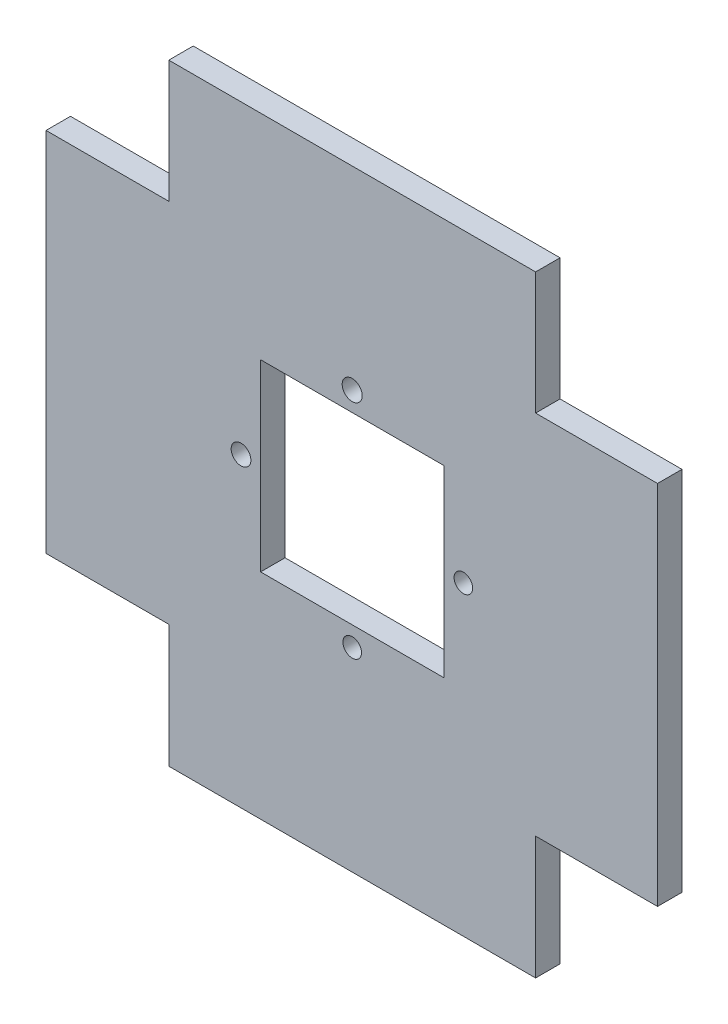
ISO-10303-21;
HEADER;
FILE_DESCRIPTION(('STEP AP214'),'2;1');
FILE_NAME('part.step','',(''),(''),'','','');
FILE_SCHEMA(('AUTOMOTIVE_DESIGN { 1 0 10303 214 1 1 1 1 }'));
ENDSEC;
DATA;
#1=APPLICATION_CONTEXT('core data for automotive mechanical design processes');
#2=APPLICATION_PROTOCOL_DEFINITION('international standard','automotive_design',2000,#1);
#3=PRODUCT_CONTEXT('',#1,'mechanical');
#4=PRODUCT('Part','Part','',(#3));
#5=PRODUCT_RELATED_PRODUCT_CATEGORY('part','',(#4));
#6=PRODUCT_DEFINITION_FORMATION('','',#4);
#7=PRODUCT_DEFINITION_CONTEXT('part definition',#1,'design');
#8=PRODUCT_DEFINITION('design','',#6,#7);
#9=PRODUCT_DEFINITION_SHAPE('','',#8);
#10=(LENGTH_UNIT() NAMED_UNIT(*) SI_UNIT(.MILLI.,.METRE.));
#11=(NAMED_UNIT(*) PLANE_ANGLE_UNIT() SI_UNIT($,.RADIAN.));
#12=(NAMED_UNIT(*) SI_UNIT($,.STERADIAN.) SOLID_ANGLE_UNIT());
#13=UNCERTAINTY_MEASURE_WITH_UNIT(LENGTH_MEASURE(1.E-05),#10,'distance_accuracy_value','');
#14=(GEOMETRIC_REPRESENTATION_CONTEXT(3) GLOBAL_UNCERTAINTY_ASSIGNED_CONTEXT((#13)) GLOBAL_UNIT_ASSIGNED_CONTEXT((#10,
#11,#12)) REPRESENTATION_CONTEXT('',''));
#15=CARTESIAN_POINT('',(0.,0.,0.));
#16=DIRECTION('',(0.,0.,1.));
#17=DIRECTION('',(1.,0.,0.));
#18=AXIS2_PLACEMENT_3D('',#15,#16,#17);
#19=CARTESIAN_POINT('',(0.,0.,5.08));
#20=DIRECTION('',(0.,0.,-1.));
#21=DIRECTION('',(-1.,0.,0.));
#22=AXIS2_PLACEMENT_3D('',#19,#20,#21);
#23=PLANE('',#22);
#24=DIRECTION('',(0.,1.,0.));
#25=VECTOR('',#24,1.);
#26=CARTESIAN_POINT('',(49.3720443960014,30.5126851184203,5.08));
#27=LINE('',#26,#25);
#28=CARTESIAN_POINT('',(49.3720443960015,5.12221589112444,5.08));
#29=VERTEX_POINT('',#28);
#30=CARTESIAN_POINT('',(49.3720443960014,30.5126851184203,5.08));
#31=VERTEX_POINT('',#30);
#32=EDGE_CURVE('E185',#29,#31,#27,.T.);
#33=ORIENTED_EDGE('',*,*,#32,.T.);
#34=DIRECTION('',(-1.,0.,0.));
#35=VECTOR('',#34,1.);
#36=CARTESIAN_POINT('',(49.3720443960014,30.5126851184203,5.08));
#37=LINE('',#36,#35);
#38=CARTESIAN_POINT('',(-26.8112910536944,30.5126851184203,5.08));
#39=VERTEX_POINT('',#38);
#40=EDGE_CURVE('E188',#31,#39,#37,.T.);
#41=ORIENTED_EDGE('',*,*,#40,.T.);
#42=DIRECTION('',(0.,-1.,0.));
#43=VECTOR('',#42,1.);
#44=CARTESIAN_POINT('',(-26.8112910536944,30.5126851184203,5.08));
#45=LINE('',#44,#43);
#46=CARTESIAN_POINT('',(-26.8112910536944,5.1222158911246,5.08));
#47=VERTEX_POINT('',#46);
#48=EDGE_CURVE('E191',#39,#47,#45,.T.);
#49=ORIENTED_EDGE('',*,*,#48,.T.);
#50=DIRECTION('',(-1.,0.,0.));
#51=VECTOR('',#50,1.);
#52=CARTESIAN_POINT('',(-52.3074602030063,5.1222158911246,5.08));
#53=LINE('',#52,#51);
#54=CARTESIAN_POINT('',(-52.3074602030063,5.1222158911246,5.08));
#55=VERTEX_POINT('',#54);
#56=EDGE_CURVE('E193',#47,#55,#53,.T.);
#57=ORIENTED_EDGE('',*,*,#56,.T.);
#58=DIRECTION('',(0.,-1.,0.));
#59=VECTOR('',#58,1.);
#60=CARTESIAN_POINT('',(-52.3074602030063,5.1222158911246,5.08));
#61=LINE('',#60,#59);
#62=CARTESIAN_POINT('',(-52.3074602030063,-70.962795052029,5.08));
#63=VERTEX_POINT('',#62);
#64=EDGE_CURVE('E195',#55,#63,#61,.T.);
#65=ORIENTED_EDGE('',*,*,#64,.T.);
#66=DIRECTION('',(1.,0.,0.));
#67=VECTOR('',#66,1.);
#68=CARTESIAN_POINT('',(-52.3074602030063,-70.962795052029,5.08));
#69=LINE('',#68,#67);
#70=CARTESIAN_POINT('',(-26.8112910536944,-70.962795052029,5.08));
#71=VERTEX_POINT('',#70);
#72=EDGE_CURVE('E197',#63,#71,#69,.T.);
#73=ORIENTED_EDGE('',*,*,#72,.T.);
#74=DIRECTION('',(0.,-1.,0.));
#75=VECTOR('',#74,1.);
#76=CARTESIAN_POINT('',(-26.8112910536944,-96.4873148815797,5.08));
#77=LINE('',#76,#75);
#78=CARTESIAN_POINT('',(-26.8112910536944,-96.4873148815797,5.08));
#79=VERTEX_POINT('',#78);
#80=EDGE_CURVE('E199',#71,#79,#77,.T.);
#81=ORIENTED_EDGE('',*,*,#80,.T.);
#82=DIRECTION('',(1.,0.,0.));
#83=VECTOR('',#82,1.);
#84=CARTESIAN_POINT('',(49.3720443960015,-96.4873148815797,5.08));
#85=LINE('',#84,#83);
#86=CARTESIAN_POINT('',(49.3720443960015,-96.4873148815797,5.08));
#87=VERTEX_POINT('',#86);
#88=EDGE_CURVE('E201',#79,#87,#85,.T.);
#89=ORIENTED_EDGE('',*,*,#88,.T.);
#90=DIRECTION('',(0.,1.,0.));
#91=VECTOR('',#90,1.);
#92=CARTESIAN_POINT('',(49.3720443960015,-96.4873148815797,5.08));
#93=LINE('',#92,#91);
#94=CARTESIAN_POINT('',(49.3720443960015,-70.962795052029,5.08));
#95=VERTEX_POINT('',#94);
#96=EDGE_CURVE('E203',#87,#95,#93,.T.);
#97=ORIENTED_EDGE('',*,*,#96,.T.);
#98=DIRECTION('',(1.,0.,0.));
#99=VECTOR('',#98,1.);
#100=CARTESIAN_POINT('',(74.6925397969937,-70.962795052029,5.08));
#101=LINE('',#100,#99);
#102=CARTESIAN_POINT('',(74.6925397969937,-70.962795052029,5.08));
#103=VERTEX_POINT('',#102);
#104=EDGE_CURVE('E205',#95,#103,#101,.T.);
#105=ORIENTED_EDGE('',*,*,#104,.T.);
#106=DIRECTION('',(0.,1.,0.));
#107=VECTOR('',#106,1.);
#108=CARTESIAN_POINT('',(74.6925397969937,5.1222158911246,5.08));
#109=LINE('',#108,#107);
#110=CARTESIAN_POINT('',(74.6925397969937,5.1222158911246,5.08));
#111=VERTEX_POINT('',#110);
#112=EDGE_CURVE('E207',#103,#111,#109,.T.);
#113=ORIENTED_EDGE('',*,*,#112,.T.);
#114=DIRECTION('',(-1.,0.,0.));
#115=VECTOR('',#114,1.);
#116=CARTESIAN_POINT('',(74.6925397969937,5.1222158911246,5.08));
#117=LINE('',#116,#115);
#118=EDGE_CURVE('E209',#111,#29,#117,.T.);
#119=ORIENTED_EDGE('',*,*,#118,.T.);
#120=EDGE_LOOP('',(#33,#41,#49,#57,#65,#73,#81,#89,#97,#105,#113,#119));
#121=FACE_BOUND('',#120,.T.);
#122=DIRECTION('',(0.,1.,0.));
#123=VECTOR('',#122,1.);
#124=CARTESIAN_POINT('',(30.3055315080126,-13.8368028294726,5.08));
#125=LINE('',#124,#123);
#126=CARTESIAN_POINT('',(30.3055315080126,-52.0037763314318,5.08));
#127=VERTEX_POINT('',#126);
#128=CARTESIAN_POINT('',(30.3055315080126,-13.8368028294726,5.08));
#129=VERTEX_POINT('',#128);
#130=EDGE_CURVE('E146',#127,#129,#125,.T.);
#131=ORIENTED_EDGE('',*,*,#130,.F.);
#132=DIRECTION('',(1.,0.,0.));
#133=VECTOR('',#132,1.);
#134=CARTESIAN_POINT('',(-7.74477816570549,-52.0037763314318,5.08));
#135=LINE('',#134,#133);
#136=CARTESIAN_POINT('',(-7.74477816570549,-52.0037763314318,5.08));
#137=VERTEX_POINT('',#136);
#138=EDGE_CURVE('E169',#137,#127,#135,.T.);
#139=ORIENTED_EDGE('',*,*,#138,.F.);
#140=DIRECTION('',(0.,-1.,0.));
#141=VECTOR('',#140,1.);
#142=CARTESIAN_POINT('',(-7.74477816570549,-13.8368028294726,5.08));
#143=LINE('',#142,#141);
#144=CARTESIAN_POINT('',(-7.74477816570549,-13.8368028294726,5.08));
#145=VERTEX_POINT('',#144);
#146=EDGE_CURVE('E167',#145,#137,#143,.T.);
#147=ORIENTED_EDGE('',*,*,#146,.F.);
#148=DIRECTION('',(-1.,0.,0.));
#149=VECTOR('',#148,1.);
#150=CARTESIAN_POINT('',(-7.74477816570549,-13.8368028294726,5.08));
#151=LINE('',#150,#149);
#152=EDGE_CURVE('E154',#129,#145,#151,.T.);
#153=ORIENTED_EDGE('',*,*,#152,.F.);
#154=EDGE_LOOP('',(#131,#139,#147,#153));
#155=FACE_BOUND('',#154,.T.);
#156=CARTESIAN_POINT('',(11.2803766711535,-9.77280282947262,5.08));
#157=DIRECTION('',(0.,0.,1.));
#158=DIRECTION('',(1.,0.,0.));
#159=AXIS2_PLACEMENT_3D('',#156,#157,#158);
#160=CIRCLE('',#159,2.08028948005198);
#161=CARTESIAN_POINT('',(13.3606661512055,-9.77280282947262,5.08));
#162=VERTEX_POINT('',#161);
#163=EDGE_CURVE('E175',#162,#162,#160,.T.);
#164=ORIENTED_EDGE('',*,*,#163,.F.);
#165=EDGE_LOOP('',(#164));
#166=FACE_BOUND('',#165,.T.);
#167=CARTESIAN_POINT('',(34.3695315080126,-32.9202895804522,5.08));
#168=DIRECTION('',(0.,0.,1.));
#169=DIRECTION('',(1.,0.,0.));
#170=AXIS2_PLACEMENT_3D('',#167,#168,#169);
#171=CIRCLE('',#170,1.93060522333524);
#172=CARTESIAN_POINT('',(36.3001367313478,-32.9202895804522,5.08));
#173=VERTEX_POINT('',#172);
#174=EDGE_CURVE('E529',#173,#173,#171,.T.);
#175=ORIENTED_EDGE('',*,*,#174,.F.);
#176=EDGE_LOOP('',(#175));
#177=FACE_BOUND('',#176,.T.);
#178=CARTESIAN_POINT('',(11.2803766711535,-56.0677763314318,5.08));
#179=DIRECTION('',(0.,0.,1.));
#180=DIRECTION('',(1.,0.,0.));
#181=AXIS2_PLACEMENT_3D('',#178,#179,#180);
#182=CIRCLE('',#181,1.93164346510318);
#183=CARTESIAN_POINT('',(13.2120201362567,-56.0677763314318,5.08));
#184=VERTEX_POINT('',#183);
#185=EDGE_CURVE('E523',#184,#184,#182,.T.);
#186=ORIENTED_EDGE('',*,*,#185,.F.);
#187=EDGE_LOOP('',(#186));
#188=FACE_BOUND('',#187,.T.);
#189=CARTESIAN_POINT('',(-11.8087781657055,-32.9202895804522,5.08));
#190=DIRECTION('',(0.,0.,1.));
#191=DIRECTION('',(1.,0.,0.));
#192=AXIS2_PLACEMENT_3D('',#189,#190,#191);
#193=CIRCLE('',#192,2.05196005215576);
#194=CARTESIAN_POINT('',(-9.75681811354972,-32.9202895804522,5.08));
#195=VERTEX_POINT('',#194);
#196=EDGE_CURVE('E514',#195,#195,#193,.T.);
#197=ORIENTED_EDGE('',*,*,#196,.F.);
#198=EDGE_LOOP('',(#197));
#199=FACE_BOUND('',#198,.T.);
#200=ADVANCED_FACE('F33',(#121,#155,#166,#177,#188,#199),#23,.F.);
#201=CARTESIAN_POINT('',(0.,0.,0.));
#202=DIRECTION('',(0.,0.,-1.));
#203=DIRECTION('',(-1.,0.,0.));
#204=AXIS2_PLACEMENT_3D('',#201,#202,#203);
#205=PLANE('',#204);
#206=CARTESIAN_POINT('',(11.2803766711535,-56.0677763314318,0.));
#207=DIRECTION('',(0.,0.,1.));
#208=DIRECTION('',(1.,0.,0.));
#209=AXIS2_PLACEMENT_3D('',#206,#207,#208);
#210=CIRCLE('',#209,1.93164346510318);
#211=CARTESIAN_POINT('',(13.2120201362567,-56.0677763314318,0.));
#212=VERTEX_POINT('',#211);
#213=EDGE_CURVE('E520',#212,#212,#210,.T.);
#214=ORIENTED_EDGE('',*,*,#213,.T.);
#215=EDGE_LOOP('',(#214));
#216=FACE_BOUND('',#215,.T.);
#217=CARTESIAN_POINT('',(11.2803766711535,-9.77280282947262,0.));
#218=DIRECTION('',(0.,0.,1.));
#219=DIRECTION('',(1.,0.,0.));
#220=AXIS2_PLACEMENT_3D('',#217,#218,#219);
#221=CIRCLE('',#220,2.08028948005198);
#222=CARTESIAN_POINT('',(13.3606661512055,-9.77280282947262,0.));
#223=VERTEX_POINT('',#222);
#224=EDGE_CURVE('E532',#223,#223,#221,.T.);
#225=ORIENTED_EDGE('',*,*,#224,.T.);
#226=EDGE_LOOP('',(#225));
#227=FACE_BOUND('',#226,.T.);
#228=DIRECTION('',(0.,1.,0.));
#229=VECTOR('',#228,1.);
#230=CARTESIAN_POINT('',(49.3720443960014,30.5126851184203,0.));
#231=LINE('',#230,#229);
#232=CARTESIAN_POINT('',(49.3720443960015,5.12221589112444,0.));
#233=VERTEX_POINT('',#232);
#234=CARTESIAN_POINT('',(49.3720443960014,30.5126851184203,0.));
#235=VERTEX_POINT('',#234);
#236=EDGE_CURVE('E162',#233,#235,#231,.T.);
#237=ORIENTED_EDGE('',*,*,#236,.F.);
#238=DIRECTION('',(-1.,0.,0.));
#239=VECTOR('',#238,1.);
#240=CARTESIAN_POINT('',(74.6925397969937,5.1222158911246,0.));
#241=LINE('',#240,#239);
#242=CARTESIAN_POINT('',(74.6925397969937,5.1222158911246,0.));
#243=VERTEX_POINT('',#242);
#244=EDGE_CURVE('E189',#243,#233,#241,.T.);
#245=ORIENTED_EDGE('',*,*,#244,.F.);
#246=DIRECTION('',(0.,1.,0.));
#247=VECTOR('',#246,1.);
#248=CARTESIAN_POINT('',(74.6925397969937,5.1222158911246,0.));
#249=LINE('',#248,#247);
#250=CARTESIAN_POINT('',(74.6925397969937,-70.962795052029,0.));
#251=VERTEX_POINT('',#250);
#252=EDGE_CURVE('E232',#251,#243,#249,.T.);
#253=ORIENTED_EDGE('',*,*,#252,.F.);
#254=DIRECTION('',(1.,0.,0.));
#255=VECTOR('',#254,1.);
#256=CARTESIAN_POINT('',(74.6925397969937,-70.962795052029,0.));
#257=LINE('',#256,#255);
#258=CARTESIAN_POINT('',(49.3720443960015,-70.962795052029,0.));
#259=VERTEX_POINT('',#258);
#260=EDGE_CURVE('E230',#259,#251,#257,.T.);
#261=ORIENTED_EDGE('',*,*,#260,.F.);
#262=DIRECTION('',(0.,1.,0.));
#263=VECTOR('',#262,1.);
#264=CARTESIAN_POINT('',(49.3720443960015,-96.4873148815797,0.));
#265=LINE('',#264,#263);
#266=CARTESIAN_POINT('',(49.3720443960015,-96.4873148815797,0.));
#267=VERTEX_POINT('',#266);
#268=EDGE_CURVE('E228',#267,#259,#265,.T.);
#269=ORIENTED_EDGE('',*,*,#268,.F.);
#270=DIRECTION('',(1.,0.,0.));
#271=VECTOR('',#270,1.);
#272=CARTESIAN_POINT('',(49.3720443960015,-96.4873148815797,0.));
#273=LINE('',#272,#271);
#274=CARTESIAN_POINT('',(-26.8112910536944,-96.4873148815797,0.));
#275=VERTEX_POINT('',#274);
#276=EDGE_CURVE('E226',#275,#267,#273,.T.);
#277=ORIENTED_EDGE('',*,*,#276,.F.);
#278=DIRECTION('',(0.,-1.,0.));
#279=VECTOR('',#278,1.);
#280=CARTESIAN_POINT('',(-26.8112910536944,-96.4873148815797,0.));
#281=LINE('',#280,#279);
#282=CARTESIAN_POINT('',(-26.8112910536944,-70.962795052029,0.));
#283=VERTEX_POINT('',#282);
#284=EDGE_CURVE('E224',#283,#275,#281,.T.);
#285=ORIENTED_EDGE('',*,*,#284,.F.);
#286=DIRECTION('',(1.,0.,0.));
#287=VECTOR('',#286,1.);
#288=CARTESIAN_POINT('',(-52.3074602030063,-70.962795052029,0.));
#289=LINE('',#288,#287);
#290=CARTESIAN_POINT('',(-52.3074602030063,-70.962795052029,0.));
#291=VERTEX_POINT('',#290);
#292=EDGE_CURVE('E222',#291,#283,#289,.T.);
#293=ORIENTED_EDGE('',*,*,#292,.F.);
#294=DIRECTION('',(0.,-1.,0.));
#295=VECTOR('',#294,1.);
#296=CARTESIAN_POINT('',(-52.3074602030063,5.1222158911246,0.));
#297=LINE('',#296,#295);
#298=CARTESIAN_POINT('',(-52.3074602030063,5.1222158911246,0.));
#299=VERTEX_POINT('',#298);
#300=EDGE_CURVE('E220',#299,#291,#297,.T.);
#301=ORIENTED_EDGE('',*,*,#300,.F.);
#302=DIRECTION('',(-1.,0.,0.));
#303=VECTOR('',#302,1.);
#304=CARTESIAN_POINT('',(-52.3074602030063,5.1222158911246,0.));
#305=LINE('',#304,#303);
#306=CARTESIAN_POINT('',(-26.8112910536944,5.1222158911246,0.));
#307=VERTEX_POINT('',#306);
#308=EDGE_CURVE('E218',#307,#299,#305,.T.);
#309=ORIENTED_EDGE('',*,*,#308,.F.);
#310=DIRECTION('',(0.,-1.,0.));
#311=VECTOR('',#310,1.);
#312=CARTESIAN_POINT('',(-26.8112910536944,30.5126851184203,0.));
#313=LINE('',#312,#311);
#314=CARTESIAN_POINT('',(-26.8112910536944,30.5126851184203,0.));
#315=VERTEX_POINT('',#314);
#316=EDGE_CURVE('E216',#315,#307,#313,.T.);
#317=ORIENTED_EDGE('',*,*,#316,.F.);
#318=DIRECTION('',(-1.,0.,0.));
#319=VECTOR('',#318,1.);
#320=CARTESIAN_POINT('',(49.3720443960014,30.5126851184203,0.));
#321=LINE('',#320,#319);
#322=EDGE_CURVE('E214',#235,#315,#321,.T.);
#323=ORIENTED_EDGE('',*,*,#322,.F.);
#324=EDGE_LOOP('',(#237,#245,#253,#261,#269,#277,#285,#293,#301,#309,#317,#323));
#325=FACE_BOUND('',#324,.T.);
#326=DIRECTION('',(1.,0.,0.));
#327=VECTOR('',#326,1.);
#328=CARTESIAN_POINT('',(-7.74477816570549,-52.0037763314318,0.));
#329=LINE('',#328,#327);
#330=CARTESIAN_POINT('',(-7.74477816570549,-52.0037763314318,0.));
#331=VERTEX_POINT('',#330);
#332=CARTESIAN_POINT('',(30.3055315080126,-52.0037763314318,0.));
#333=VERTEX_POINT('',#332);
#334=EDGE_CURVE('E155',#331,#333,#329,.T.);
#335=ORIENTED_EDGE('',*,*,#334,.T.);
#336=DIRECTION('',(0.,1.,0.));
#337=VECTOR('',#336,1.);
#338=CARTESIAN_POINT('',(30.3055315080126,-13.8368028294726,0.));
#339=LINE('',#338,#337);
#340=CARTESIAN_POINT('',(30.3055315080126,-13.8368028294726,0.));
#341=VERTEX_POINT('',#340);
#342=EDGE_CURVE('E56',#333,#341,#339,.T.);
#343=ORIENTED_EDGE('',*,*,#342,.T.);
#344=DIRECTION('',(-1.,0.,0.));
#345=VECTOR('',#344,1.);
#346=CARTESIAN_POINT('',(-7.74477816570549,-13.8368028294726,0.));
#347=LINE('',#346,#345);
#348=CARTESIAN_POINT('',(-7.74477816570549,-13.8368028294726,0.));
#349=VERTEX_POINT('',#348);
#350=EDGE_CURVE('E161',#341,#349,#347,.T.);
#351=ORIENTED_EDGE('',*,*,#350,.T.);
#352=DIRECTION('',(0.,-1.,0.));
#353=VECTOR('',#352,1.);
#354=CARTESIAN_POINT('',(-7.74477816570549,-13.8368028294726,0.));
#355=LINE('',#354,#353);
#356=EDGE_CURVE('E177',#349,#331,#355,.T.);
#357=ORIENTED_EDGE('',*,*,#356,.T.);
#358=EDGE_LOOP('',(#335,#343,#351,#357));
#359=FACE_BOUND('',#358,.T.);
#360=CARTESIAN_POINT('',(34.3695315080126,-32.9202895804522,0.));
#361=DIRECTION('',(0.,0.,1.));
#362=DIRECTION('',(1.,0.,0.));
#363=AXIS2_PLACEMENT_3D('',#360,#361,#362);
#364=CIRCLE('',#363,1.93060522333524);
#365=CARTESIAN_POINT('',(36.3001367313478,-32.9202895804522,0.));
#366=VERTEX_POINT('',#365);
#367=EDGE_CURVE('E526',#366,#366,#364,.T.);
#368=ORIENTED_EDGE('',*,*,#367,.T.);
#369=EDGE_LOOP('',(#368));
#370=FACE_BOUND('',#369,.T.);
#371=CARTESIAN_POINT('',(-11.8087781657055,-32.9202895804522,0.));
#372=DIRECTION('',(0.,0.,1.));
#373=DIRECTION('',(1.,0.,0.));
#374=AXIS2_PLACEMENT_3D('',#371,#372,#373);
#375=CIRCLE('',#374,2.05196005215576);
#376=CARTESIAN_POINT('',(-9.75681811354972,-32.9202895804522,0.));
#377=VERTEX_POINT('',#376);
#378=EDGE_CURVE('E517',#377,#377,#375,.T.);
#379=ORIENTED_EDGE('',*,*,#378,.T.);
#380=EDGE_LOOP('',(#379));
#381=FACE_BOUND('',#380,.T.);
#382=ADVANCED_FACE('F274',(#216,#227,#325,#359,#370,#381),#205,.T.);
#383=CARTESIAN_POINT('',(49.3720443960014,30.5126851184203,5.08));
#384=DIRECTION('',(-1.,0.,0.));
#385=DIRECTION('',(0.,-1.,0.));
#386=AXIS2_PLACEMENT_3D('',#383,#384,#385);
#387=PLANE('',#386);
#388=ORIENTED_EDGE('',*,*,#236,.T.);
#389=DIRECTION('',(0.,0.,-1.));
#390=VECTOR('',#389,1.);
#391=CARTESIAN_POINT('',(49.3720443960014,30.5126851184203,5.08));
#392=LINE('',#391,#390);
#393=EDGE_CURVE('E11',#31,#235,#392,.T.);
#394=ORIENTED_EDGE('',*,*,#393,.F.);
#395=ORIENTED_EDGE('',*,*,#32,.F.);
#396=DIRECTION('',(0.,0.,-1.));
#397=VECTOR('',#396,1.);
#398=CARTESIAN_POINT('',(49.3720443960015,5.12221589112444,5.08));
#399=LINE('',#398,#397);
#400=EDGE_CURVE('E211',#29,#233,#399,.T.);
#401=ORIENTED_EDGE('',*,*,#400,.T.);
#402=EDGE_LOOP('',(#388,#394,#395,#401));
#403=FACE_BOUND('',#402,.T.);
#404=ADVANCED_FACE('F35',(#403),#387,.F.);
#405=CARTESIAN_POINT('',(49.3720443960014,30.5126851184203,5.08));
#406=DIRECTION('',(0.,-1.,0.));
#407=DIRECTION('',(1.,0.,0.));
#408=AXIS2_PLACEMENT_3D('',#405,#406,#407);
#409=PLANE('',#408);
#410=ORIENTED_EDGE('',*,*,#322,.T.);
#411=DIRECTION('',(0.,0.,-1.));
#412=VECTOR('',#411,1.);
#413=CARTESIAN_POINT('',(-26.8112910536944,30.5126851184203,5.08));
#414=LINE('',#413,#412);
#415=EDGE_CURVE('E41',#39,#315,#414,.T.);
#416=ORIENTED_EDGE('',*,*,#415,.F.);
#417=ORIENTED_EDGE('',*,*,#40,.F.);
#418=ORIENTED_EDGE('',*,*,#393,.T.);
#419=EDGE_LOOP('',(#410,#416,#417,#418));
#420=FACE_BOUND('',#419,.T.);
#421=ADVANCED_FACE('F291',(#420),#409,.F.);
#422=CARTESIAN_POINT('',(-26.8112910536944,30.5126851184203,5.08));
#423=DIRECTION('',(1.,0.,0.));
#424=DIRECTION('',(0.,1.,0.));
#425=AXIS2_PLACEMENT_3D('',#422,#423,#424);
#426=PLANE('',#425);
#427=ORIENTED_EDGE('',*,*,#316,.T.);
#428=DIRECTION('',(0.,0.,-1.));
#429=VECTOR('',#428,1.);
#430=CARTESIAN_POINT('',(-26.8112910536944,5.1222158911246,5.08));
#431=LINE('',#430,#429);
#432=EDGE_CURVE('E261',#47,#307,#431,.T.);
#433=ORIENTED_EDGE('',*,*,#432,.F.);
#434=ORIENTED_EDGE('',*,*,#48,.F.);
#435=ORIENTED_EDGE('',*,*,#415,.T.);
#436=EDGE_LOOP('',(#427,#433,#434,#435));
#437=FACE_BOUND('',#436,.T.);
#438=ADVANCED_FACE('F268',(#437),#426,.F.);
#439=CARTESIAN_POINT('',(-52.3074602030063,5.1222158911246,5.08));
#440=DIRECTION('',(0.,-1.,0.));
#441=DIRECTION('',(0.,0.,-1.));
#442=AXIS2_PLACEMENT_3D('',#439,#440,#441);
#443=PLANE('',#442);
#444=ORIENTED_EDGE('',*,*,#308,.T.);
#445=DIRECTION('',(0.,0.,-1.));
#446=VECTOR('',#445,1.);
#447=CARTESIAN_POINT('',(-52.3074602030063,5.1222158911246,5.08));
#448=LINE('',#447,#446);
#449=EDGE_CURVE('E258',#55,#299,#448,.T.);
#450=ORIENTED_EDGE('',*,*,#449,.F.);
#451=ORIENTED_EDGE('',*,*,#56,.F.);
#452=ORIENTED_EDGE('',*,*,#432,.T.);
#453=EDGE_LOOP('',(#444,#450,#451,#452));
#454=FACE_BOUND('',#453,.T.);
#455=ADVANCED_FACE('F280',(#454),#443,.F.);
#456=CARTESIAN_POINT('',(-52.3074602030063,5.1222158911246,5.08));
#457=DIRECTION('',(1.,0.,0.));
#458=DIRECTION('',(0.,1.,0.));
#459=AXIS2_PLACEMENT_3D('',#456,#457,#458);
#460=PLANE('',#459);
#461=ORIENTED_EDGE('',*,*,#300,.T.);
#462=DIRECTION('',(0.,0.,-1.));
#463=VECTOR('',#462,1.);
#464=CARTESIAN_POINT('',(-52.3074602030063,-70.962795052029,5.08));
#465=LINE('',#464,#463);
#466=EDGE_CURVE('E255',#63,#291,#465,.T.);
#467=ORIENTED_EDGE('',*,*,#466,.F.);
#468=ORIENTED_EDGE('',*,*,#64,.F.);
#469=ORIENTED_EDGE('',*,*,#449,.T.);
#470=EDGE_LOOP('',(#461,#467,#468,#469));
#471=FACE_BOUND('',#470,.T.);
#472=ADVANCED_FACE('F284',(#471),#460,.F.);
#473=CARTESIAN_POINT('',(-52.3074602030063,-70.962795052029,5.08));
#474=DIRECTION('',(0.,1.,0.));
#475=DIRECTION('',(0.,0.,1.));
#476=AXIS2_PLACEMENT_3D('',#473,#474,#475);
#477=PLANE('',#476);
#478=ORIENTED_EDGE('',*,*,#292,.T.);
#479=DIRECTION('',(0.,0.,-1.));
#480=VECTOR('',#479,1.);
#481=CARTESIAN_POINT('',(-26.8112910536944,-70.962795052029,5.08));
#482=LINE('',#481,#480);
#483=EDGE_CURVE('E252',#71,#283,#482,.T.);
#484=ORIENTED_EDGE('',*,*,#483,.F.);
#485=ORIENTED_EDGE('',*,*,#72,.F.);
#486=ORIENTED_EDGE('',*,*,#466,.T.);
#487=EDGE_LOOP('',(#478,#484,#485,#486));
#488=FACE_BOUND('',#487,.T.);
#489=ADVANCED_FACE('F324',(#488),#477,.F.);
#490=CARTESIAN_POINT('',(-26.8112910536944,-96.4873148815797,5.08));
#491=DIRECTION('',(1.,0.,0.));
#492=DIRECTION('',(0.,0.,-1.));
#493=AXIS2_PLACEMENT_3D('',#490,#491,#492);
#494=PLANE('',#493);
#495=ORIENTED_EDGE('',*,*,#284,.T.);
#496=DIRECTION('',(0.,0.,-1.));
#497=VECTOR('',#496,1.);
#498=CARTESIAN_POINT('',(-26.8112910536944,-96.4873148815797,5.08));
#499=LINE('',#498,#497);
#500=EDGE_CURVE('E249',#79,#275,#499,.T.);
#501=ORIENTED_EDGE('',*,*,#500,.F.);
#502=ORIENTED_EDGE('',*,*,#80,.F.);
#503=ORIENTED_EDGE('',*,*,#483,.T.);
#504=EDGE_LOOP('',(#495,#501,#502,#503));
#505=FACE_BOUND('',#504,.T.);
#506=ADVANCED_FACE('F322',(#505),#494,.F.);
#507=CARTESIAN_POINT('',(49.3720443960015,-96.4873148815797,5.08));
#508=DIRECTION('',(0.,1.,0.));
#509=DIRECTION('',(-1.,0.,0.));
#510=AXIS2_PLACEMENT_3D('',#507,#508,#509);
#511=PLANE('',#510);
#512=ORIENTED_EDGE('',*,*,#276,.T.);
#513=DIRECTION('',(0.,0.,-1.));
#514=VECTOR('',#513,1.);
#515=CARTESIAN_POINT('',(49.3720443960015,-96.4873148815797,5.08));
#516=LINE('',#515,#514);
#517=EDGE_CURVE('E246',#87,#267,#516,.T.);
#518=ORIENTED_EDGE('',*,*,#517,.F.);
#519=ORIENTED_EDGE('',*,*,#88,.F.);
#520=ORIENTED_EDGE('',*,*,#500,.T.);
#521=EDGE_LOOP('',(#512,#518,#519,#520));
#522=FACE_BOUND('',#521,.T.);
#523=ADVANCED_FACE('F318',(#522),#511,.F.);
#524=CARTESIAN_POINT('',(49.3720443960015,-96.4873148815797,5.08));
#525=DIRECTION('',(-1.,0.,0.));
#526=DIRECTION('',(0.,0.,1.));
#527=AXIS2_PLACEMENT_3D('',#524,#525,#526);
#528=PLANE('',#527);
#529=ORIENTED_EDGE('',*,*,#268,.T.);
#530=DIRECTION('',(0.,0.,-1.));
#531=VECTOR('',#530,1.);
#532=CARTESIAN_POINT('',(49.3720443960015,-70.962795052029,5.08));
#533=LINE('',#532,#531);
#534=EDGE_CURVE('E243',#95,#259,#533,.T.);
#535=ORIENTED_EDGE('',*,*,#534,.F.);
#536=ORIENTED_EDGE('',*,*,#96,.F.);
#537=ORIENTED_EDGE('',*,*,#517,.T.);
#538=EDGE_LOOP('',(#529,#535,#536,#537));
#539=FACE_BOUND('',#538,.T.);
#540=ADVANCED_FACE('F313',(#539),#528,.F.);
#541=CARTESIAN_POINT('',(74.6925397969937,-70.962795052029,5.08));
#542=DIRECTION('',(0.,1.,0.));
#543=DIRECTION('',(0.,0.,1.));
#544=AXIS2_PLACEMENT_3D('',#541,#542,#543);
#545=PLANE('',#544);
#546=ORIENTED_EDGE('',*,*,#260,.T.);
#547=DIRECTION('',(0.,0.,-1.));
#548=VECTOR('',#547,1.);
#549=CARTESIAN_POINT('',(74.6925397969937,-70.962795052029,5.08));
#550=LINE('',#549,#548);
#551=EDGE_CURVE('E240',#103,#251,#550,.T.);
#552=ORIENTED_EDGE('',*,*,#551,.F.);
#553=ORIENTED_EDGE('',*,*,#104,.F.);
#554=ORIENTED_EDGE('',*,*,#534,.T.);
#555=EDGE_LOOP('',(#546,#552,#553,#554));
#556=FACE_BOUND('',#555,.T.);
#557=ADVANCED_FACE('F307',(#556),#545,.F.);
#558=CARTESIAN_POINT('',(74.6925397969937,5.1222158911246,5.08));
#559=DIRECTION('',(-1.,0.,0.));
#560=DIRECTION('',(0.,-1.,0.));
#561=AXIS2_PLACEMENT_3D('',#558,#559,#560);
#562=PLANE('',#561);
#563=ORIENTED_EDGE('',*,*,#252,.T.);
#564=DIRECTION('',(0.,0.,-1.));
#565=VECTOR('',#564,1.);
#566=CARTESIAN_POINT('',(74.6925397969937,5.1222158911246,5.08));
#567=LINE('',#566,#565);
#568=EDGE_CURVE('E237',#111,#243,#567,.T.);
#569=ORIENTED_EDGE('',*,*,#568,.F.);
#570=ORIENTED_EDGE('',*,*,#112,.F.);
#571=ORIENTED_EDGE('',*,*,#551,.T.);
#572=EDGE_LOOP('',(#563,#569,#570,#571));
#573=FACE_BOUND('',#572,.T.);
#574=ADVANCED_FACE('F303',(#573),#562,.F.);
#575=CARTESIAN_POINT('',(74.6925397969937,5.1222158911246,5.08));
#576=DIRECTION('',(0.,-1.,0.));
#577=DIRECTION('',(1.,0.,0.));
#578=AXIS2_PLACEMENT_3D('',#575,#576,#577);
#579=PLANE('',#578);
#580=ORIENTED_EDGE('',*,*,#244,.T.);
#581=ORIENTED_EDGE('',*,*,#400,.F.);
#582=ORIENTED_EDGE('',*,*,#118,.F.);
#583=ORIENTED_EDGE('',*,*,#568,.T.);
#584=EDGE_LOOP('',(#580,#581,#582,#583));
#585=FACE_BOUND('',#584,.T.);
#586=ADVANCED_FACE('F298',(#585),#579,.F.);
#587=CARTESIAN_POINT('',(30.3055315080126,-13.8368028294726,5.08));
#588=DIRECTION('',(-1.,0.,0.));
#589=DIRECTION('',(0.,0.,1.));
#590=AXIS2_PLACEMENT_3D('',#587,#588,#589);
#591=PLANE('',#590);
#592=ORIENTED_EDGE('',*,*,#342,.F.);
#593=DIRECTION('',(0.,0.,-1.));
#594=VECTOR('',#593,1.);
#595=CARTESIAN_POINT('',(30.3055315080126,-52.0037763314318,5.08));
#596=LINE('',#595,#594);
#597=EDGE_CURVE('E150',#127,#333,#596,.T.);
#598=ORIENTED_EDGE('',*,*,#597,.F.);
#599=ORIENTED_EDGE('',*,*,#130,.T.);
#600=DIRECTION('',(0.,0.,-1.));
#601=VECTOR('',#600,1.);
#602=CARTESIAN_POINT('',(30.3055315080126,-13.8368028294726,5.08));
#603=LINE('',#602,#601);
#604=EDGE_CURVE('E149',#129,#341,#603,.T.);
#605=ORIENTED_EDGE('',*,*,#604,.T.);
#606=EDGE_LOOP('',(#592,#598,#599,#605));
#607=FACE_BOUND('',#606,.T.);
#608=ADVANCED_FACE('F148',(#607),#591,.T.);
#609=CARTESIAN_POINT('',(-7.74477816570549,-13.8368028294726,5.08));
#610=DIRECTION('',(0.,-1.,0.));
#611=DIRECTION('',(0.,0.,-1.));
#612=AXIS2_PLACEMENT_3D('',#609,#610,#611);
#613=PLANE('',#612);
#614=ORIENTED_EDGE('',*,*,#350,.F.);
#615=ORIENTED_EDGE('',*,*,#604,.F.);
#616=ORIENTED_EDGE('',*,*,#152,.T.);
#617=DIRECTION('',(0.,0.,-1.));
#618=VECTOR('',#617,1.);
#619=CARTESIAN_POINT('',(-7.74477816570549,-13.8368028294726,5.08));
#620=LINE('',#619,#618);
#621=EDGE_CURVE('E163',#145,#349,#620,.T.);
#622=ORIENTED_EDGE('',*,*,#621,.T.);
#623=EDGE_LOOP('',(#614,#615,#616,#622));
#624=FACE_BOUND('',#623,.T.);
#625=ADVANCED_FACE('F158',(#624),#613,.T.);
#626=CARTESIAN_POINT('',(-7.74477816570549,-13.8368028294726,5.08));
#627=DIRECTION('',(1.,0.,0.));
#628=DIRECTION('',(0.,0.,-1.));
#629=AXIS2_PLACEMENT_3D('',#626,#627,#628);
#630=PLANE('',#629);
#631=ORIENTED_EDGE('',*,*,#356,.F.);
#632=ORIENTED_EDGE('',*,*,#621,.F.);
#633=ORIENTED_EDGE('',*,*,#146,.T.);
#634=DIRECTION('',(0.,0.,-1.));
#635=VECTOR('',#634,1.);
#636=CARTESIAN_POINT('',(-7.74477816570549,-52.0037763314318,5.08));
#637=LINE('',#636,#635);
#638=EDGE_CURVE('E48',#137,#331,#637,.T.);
#639=ORIENTED_EDGE('',*,*,#638,.T.);
#640=EDGE_LOOP('',(#631,#632,#633,#639));
#641=FACE_BOUND('',#640,.T.);
#642=ADVANCED_FACE('F383',(#641),#630,.T.);
#643=CARTESIAN_POINT('',(-7.74477816570549,-52.0037763314318,5.08));
#644=DIRECTION('',(0.,1.,0.));
#645=DIRECTION('',(0.,0.,1.));
#646=AXIS2_PLACEMENT_3D('',#643,#644,#645);
#647=PLANE('',#646);
#648=ORIENTED_EDGE('',*,*,#334,.F.);
#649=ORIENTED_EDGE('',*,*,#638,.F.);
#650=ORIENTED_EDGE('',*,*,#138,.T.);
#651=ORIENTED_EDGE('',*,*,#597,.T.);
#652=EDGE_LOOP('',(#648,#649,#650,#651));
#653=FACE_BOUND('',#652,.T.);
#654=ADVANCED_FACE('F389',(#653),#647,.T.);
#655=CARTESIAN_POINT('',(11.2803766711535,-9.77280282947262,5.08));
#656=DIRECTION('',(0.,0.,-1.));
#657=DIRECTION('',(-1.,0.,0.));
#658=AXIS2_PLACEMENT_3D('',#655,#656,#657);
#659=CYLINDRICAL_SURFACE('',#658,2.08028948005198);
#660=ORIENTED_EDGE('',*,*,#163,.T.);
#661=EDGE_LOOP('',(#660));
#662=FACE_BOUND('',#661,.T.);
#663=ORIENTED_EDGE('',*,*,#224,.F.);
#664=EDGE_LOOP('',(#663));
#665=FACE_BOUND('',#664,.T.);
#666=ADVANCED_FACE('F397',(#662,#665),#659,.F.);
#667=CARTESIAN_POINT('',(34.3695315080126,-32.9202895804522,5.08));
#668=DIRECTION('',(0.,0.,-1.));
#669=DIRECTION('',(-1.,0.,0.));
#670=AXIS2_PLACEMENT_3D('',#667,#668,#669);
#671=CYLINDRICAL_SURFACE('',#670,1.93060522333524);
#672=ORIENTED_EDGE('',*,*,#174,.T.);
#673=EDGE_LOOP('',(#672));
#674=FACE_BOUND('',#673,.T.);
#675=ORIENTED_EDGE('',*,*,#367,.F.);
#676=EDGE_LOOP('',(#675));
#677=FACE_BOUND('',#676,.T.);
#678=ADVANCED_FACE('F404',(#674,#677),#671,.F.);
#679=CARTESIAN_POINT('',(11.2803766711535,-56.0677763314318,5.08));
#680=DIRECTION('',(0.,0.,-1.));
#681=DIRECTION('',(-1.,0.,0.));
#682=AXIS2_PLACEMENT_3D('',#679,#680,#681);
#683=CYLINDRICAL_SURFACE('',#682,1.93164346510318);
#684=ORIENTED_EDGE('',*,*,#185,.T.);
#685=EDGE_LOOP('',(#684));
#686=FACE_BOUND('',#685,.T.);
#687=ORIENTED_EDGE('',*,*,#213,.F.);
#688=EDGE_LOOP('',(#687));
#689=FACE_BOUND('',#688,.T.);
#690=ADVANCED_FACE('F412',(#686,#689),#683,.F.);
#691=CARTESIAN_POINT('',(-11.8087781657055,-32.9202895804522,5.08));
#692=DIRECTION('',(0.,0.,-1.));
#693=DIRECTION('',(-1.,0.,0.));
#694=AXIS2_PLACEMENT_3D('',#691,#692,#693);
#695=CYLINDRICAL_SURFACE('',#694,2.05196005215576);
#696=ORIENTED_EDGE('',*,*,#196,.T.);
#697=EDGE_LOOP('',(#696));
#698=FACE_BOUND('',#697,.T.);
#699=ORIENTED_EDGE('',*,*,#378,.F.);
#700=EDGE_LOOP('',(#699));
#701=FACE_BOUND('',#700,.T.);
#702=ADVANCED_FACE('F420',(#698,#701),#695,.F.);
#703=CLOSED_SHELL('',(#200,#382,#404,#421,#438,#455,#472,#489,#506,#523,#540,#557,#574,#586,
#608,#625,#642,#654,#666,#678,#690,#702));
#704=MANIFOLD_SOLID_BREP('B2',#703);
#705=ADVANCED_BREP_SHAPE_REPRESENTATION('',(#18,#704),#14);
#706=SHAPE_DEFINITION_REPRESENTATION(#9,#705);
ENDSEC;
END-ISO-10303-21;
